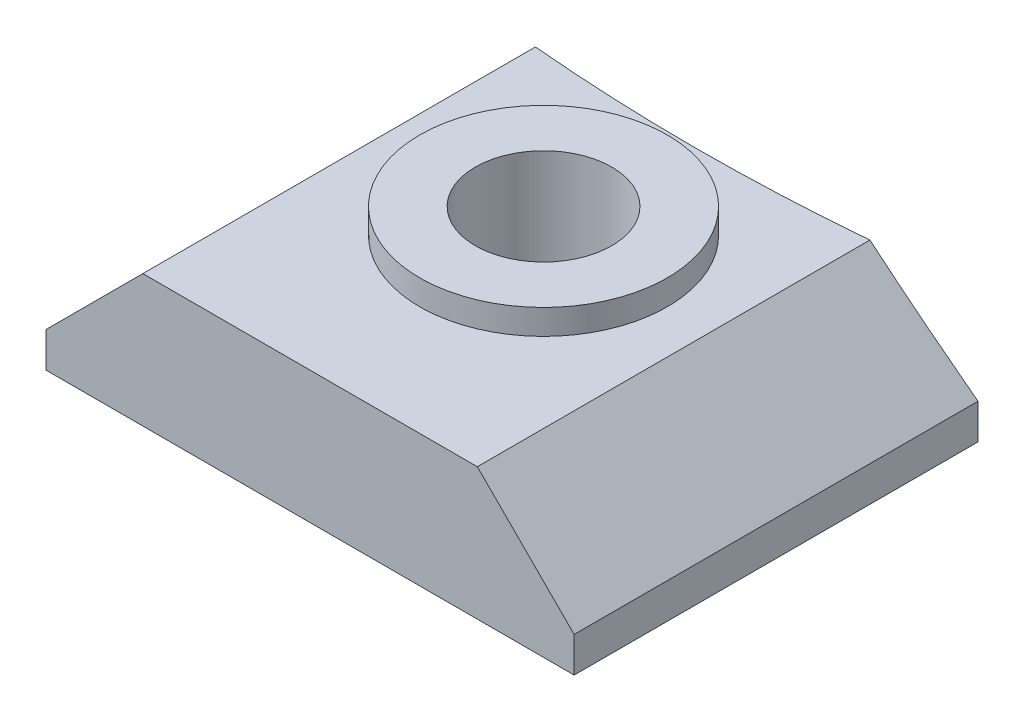
ISO-10303-21;
HEADER;
FILE_DESCRIPTION(('STEP AP214'),'2;1');
FILE_NAME('part.step','',(''),(''),'','','');
FILE_SCHEMA(('AUTOMOTIVE_DESIGN { 1 0 10303 214 1 1 1 1 }'));
ENDSEC;
DATA;
#1=APPLICATION_CONTEXT('core data for automotive mechanical design processes');
#2=APPLICATION_PROTOCOL_DEFINITION('international standard','automotive_design',2000,#1);
#3=PRODUCT_CONTEXT('',#1,'mechanical');
#4=PRODUCT('Part','Part','',(#3));
#5=PRODUCT_RELATED_PRODUCT_CATEGORY('part','',(#4));
#6=PRODUCT_DEFINITION_FORMATION('','',#4);
#7=PRODUCT_DEFINITION_CONTEXT('part definition',#1,'design');
#8=PRODUCT_DEFINITION('design','',#6,#7);
#9=PRODUCT_DEFINITION_SHAPE('','',#8);
#10=(LENGTH_UNIT() NAMED_UNIT(*) SI_UNIT(.MILLI.,.METRE.));
#11=(NAMED_UNIT(*) PLANE_ANGLE_UNIT() SI_UNIT($,.RADIAN.));
#12=(NAMED_UNIT(*) SI_UNIT($,.STERADIAN.) SOLID_ANGLE_UNIT());
#13=UNCERTAINTY_MEASURE_WITH_UNIT(LENGTH_MEASURE(1.E-05),#10,'distance_accuracy_value','');
#14=(GEOMETRIC_REPRESENTATION_CONTEXT(3) GLOBAL_UNCERTAINTY_ASSIGNED_CONTEXT((#13)) GLOBAL_UNIT_ASSIGNED_CONTEXT((#10,
#11,#12)) REPRESENTATION_CONTEXT('',''));
#15=CARTESIAN_POINT('',(0.,0.,0.));
#16=DIRECTION('',(0.,0.,1.));
#17=DIRECTION('',(1.,0.,0.));
#18=AXIS2_PLACEMENT_3D('',#15,#16,#17);
#19=CARTESIAN_POINT('',(-12.,1.6,22.));
#20=DIRECTION('',(1.,0.,0.));
#21=DIRECTION('',(0.,0.,-1.));
#22=AXIS2_PLACEMENT_3D('',#19,#20,#21);
#23=PLANE('',#22);
#24=DIRECTION('',(0.,0.,-1.));
#25=VECTOR('',#24,1.);
#26=CARTESIAN_POINT('',(-12.,1.6,22.));
#27=LINE('',#26,#25);
#28=CARTESIAN_POINT('',(-12.,1.6,22.));
#29=VERTEX_POINT('',#28);
#30=CARTESIAN_POINT('',(-12.,1.6,3.6486779456457));
#31=VERTEX_POINT('',#30);
#32=EDGE_CURVE('E119',#29,#31,#27,.T.);
#33=ORIENTED_EDGE('',*,*,#32,.T.);
#34=DIRECTION('',(0.,1.,0.));
#35=VECTOR('',#34,1.);
#36=CARTESIAN_POINT('',(-12.,0.,3.6486779456457));
#37=LINE('',#36,#35);
#38=CARTESIAN_POINT('',(-12.,0.,3.6486779456457));
#39=VERTEX_POINT('',#38);
#40=EDGE_CURVE('E50',#39,#31,#37,.T.);
#41=ORIENTED_EDGE('',*,*,#40,.F.);
#42=DIRECTION('',(0.,0.,-1.));
#43=VECTOR('',#42,1.);
#44=CARTESIAN_POINT('',(-12.,0.,22.));
#45=LINE('',#44,#43);
#46=CARTESIAN_POINT('',(-12.,0.,22.));
#47=VERTEX_POINT('',#46);
#48=EDGE_CURVE('E104',#47,#39,#45,.T.);
#49=ORIENTED_EDGE('',*,*,#48,.F.);
#50=DIRECTION('',(0.,-1.,0.));
#51=VECTOR('',#50,1.);
#52=CARTESIAN_POINT('',(-12.,1.6,22.));
#53=LINE('',#52,#51);
#54=EDGE_CURVE('E130',#29,#47,#53,.T.);
#55=ORIENTED_EDGE('',*,*,#54,.F.);
#56=EDGE_LOOP('',(#33,#41,#49,#55));
#57=FACE_BOUND('',#56,.T.);
#58=ADVANCED_FACE('F36',(#57),#23,.F.);
#59=CARTESIAN_POINT('',(-12.,0.,22.));
#60=DIRECTION('',(0.,1.,0.));
#61=DIRECTION('',(-1.,0.,0.));
#62=AXIS2_PLACEMENT_3D('',#59,#60,#61);
#63=PLANE('',#62);
#64=CARTESIAN_POINT('',(0.,0.,11.3910647809234));
#65=DIRECTION('',(0.,1.,0.));
#66=DIRECTION('',(-1.,0.,0.));
#67=AXIS2_PLACEMENT_3D('',#64,#65,#66);
#68=CIRCLE('',#67,3.1);
#69=CARTESIAN_POINT('',(-3.1,0.,11.3910647809234));
#70=VERTEX_POINT('',#69);
#71=EDGE_CURVE('E137',#70,#70,#68,.T.);
#72=ORIENTED_EDGE('',*,*,#71,.T.);
#73=EDGE_LOOP('',(#72));
#74=FACE_BOUND('',#73,.T.);
#75=ORIENTED_EDGE('',*,*,#48,.T.);
#76=CARTESIAN_POINT('',(0.,0.,-80.5));
#77=DIRECTION('',(0.,1.,0.));
#78=DIRECTION('',(0.,0.,1.));
#79=AXIS2_PLACEMENT_3D('',#76,#77,#78);
#80=CIRCLE('',#79,85.);
#81=CARTESIAN_POINT('',(12.,0.,3.6486779456457));
#82=VERTEX_POINT('',#81);
#83=EDGE_CURVE('E89',#39,#82,#80,.T.);
#84=ORIENTED_EDGE('',*,*,#83,.T.);
#85=DIRECTION('',(0.,0.,-1.));
#86=VECTOR('',#85,1.);
#87=CARTESIAN_POINT('',(12.,0.,22.));
#88=LINE('',#87,#86);
#89=CARTESIAN_POINT('',(12.,0.,22.));
#90=VERTEX_POINT('',#89);
#91=EDGE_CURVE('E101',#90,#82,#88,.T.);
#92=ORIENTED_EDGE('',*,*,#91,.F.);
#93=DIRECTION('',(1.,0.,0.));
#94=VECTOR('',#93,1.);
#95=CARTESIAN_POINT('',(-12.,0.,22.));
#96=LINE('',#95,#94);
#97=EDGE_CURVE('E128',#47,#90,#96,.T.);
#98=ORIENTED_EDGE('',*,*,#97,.F.);
#99=EDGE_LOOP('',(#75,#84,#92,#98));
#100=FACE_BOUND('',#99,.T.);
#101=ADVANCED_FACE('F100',(#74,#100),#63,.F.);
#102=CARTESIAN_POINT('',(12.,0.,22.));
#103=DIRECTION('',(-1.,0.,0.));
#104=DIRECTION('',(0.,0.,1.));
#105=AXIS2_PLACEMENT_3D('',#102,#103,#104);
#106=PLANE('',#105);
#107=ORIENTED_EDGE('',*,*,#91,.T.);
#108=DIRECTION('',(0.,1.,0.));
#109=VECTOR('',#108,1.);
#110=CARTESIAN_POINT('',(12.,0.,3.6486779456457));
#111=LINE('',#110,#109);
#112=CARTESIAN_POINT('',(12.,1.59999999999991,3.6486779456457));
#113=VERTEX_POINT('',#112);
#114=EDGE_CURVE('E86',#82,#113,#111,.T.);
#115=ORIENTED_EDGE('',*,*,#114,.T.);
#116=DIRECTION('',(0.,0.,-1.));
#117=VECTOR('',#116,1.);
#118=CARTESIAN_POINT('',(12.,1.59999999999991,22.));
#119=LINE('',#118,#117);
#120=CARTESIAN_POINT('',(12.,1.59999999999991,22.));
#121=VERTEX_POINT('',#120);
#122=EDGE_CURVE('E109',#121,#113,#119,.T.);
#123=ORIENTED_EDGE('',*,*,#122,.F.);
#124=DIRECTION('',(0.,1.,0.));
#125=VECTOR('',#124,1.);
#126=CARTESIAN_POINT('',(12.,0.,22.));
#127=LINE('',#126,#125);
#128=EDGE_CURVE('E108',#90,#121,#127,.T.);
#129=ORIENTED_EDGE('',*,*,#128,.F.);
#130=EDGE_LOOP('',(#107,#115,#123,#129));
#131=FACE_BOUND('',#130,.T.);
#132=ADVANCED_FACE('F107',(#131),#106,.F.);
#133=CARTESIAN_POINT('',(12.,1.59999999999991,22.));
#134=DIRECTION('',(-0.707106781186551,-0.707106781186544,0.));
#135=DIRECTION('',(0.707106781186544,-0.707106781186551,0.));
#136=AXIS2_PLACEMENT_3D('',#133,#134,#135);
#137=PLANE('',#136);
#138=ORIENTED_EDGE('',*,*,#122,.T.);
#139=CARTESIAN_POINT('',(0.,13.6,-80.5));
#140=DIRECTION('',(-0.707106781186551,-0.707106781186544,0.));
#141=DIRECTION('',(-0.707106781186544,0.707106781186551,0.));
#142=AXIS2_PLACEMENT_3D('',#139,#140,#141);
#143=ELLIPSE('',#142,120.208152801714,85.);
#144=CARTESIAN_POINT('',(7.59999999999996,6.,4.15955350697285));
#145=VERTEX_POINT('',#144);
#146=EDGE_CURVE('E91',#113,#145,#143,.T.);
#147=ORIENTED_EDGE('',*,*,#146,.T.);
#148=DIRECTION('',(0.,0.,-1.));
#149=VECTOR('',#148,1.);
#150=CARTESIAN_POINT('',(7.59999999999996,6.,22.));
#151=LINE('',#150,#149);
#152=CARTESIAN_POINT('',(7.59999999999996,6.,22.));
#153=VERTEX_POINT('',#152);
#154=EDGE_CURVE('E111',#153,#145,#151,.T.);
#155=ORIENTED_EDGE('',*,*,#154,.F.);
#156=DIRECTION('',(-0.707106781186544,0.707106781186551,0.));
#157=VECTOR('',#156,1.);
#158=CARTESIAN_POINT('',(12.,1.59999999999991,22.));
#159=LINE('',#158,#157);
#160=EDGE_CURVE('E125',#121,#153,#159,.T.);
#161=ORIENTED_EDGE('',*,*,#160,.F.);
#162=EDGE_LOOP('',(#138,#147,#155,#161));
#163=FACE_BOUND('',#162,.T.);
#164=ADVANCED_FACE('F150',(#163),#137,.F.);
#165=CARTESIAN_POINT('',(7.59999999999996,6.,22.));
#166=DIRECTION('',(0.,-1.,0.));
#167=DIRECTION('',(0.,0.,-1.));
#168=AXIS2_PLACEMENT_3D('',#165,#166,#167);
#169=PLANE('',#168);
#170=CARTESIAN_POINT('',(0.,6.,11.3910647809234));
#171=DIRECTION('',(0.,1.,0.));
#172=DIRECTION('',(-1.,0.,0.));
#173=AXIS2_PLACEMENT_3D('',#170,#171,#172);
#174=CIRCLE('',#173,5.625);
#175=CARTESIAN_POINT('',(-5.625,6.,11.3910647809234));
#176=VERTEX_POINT('',#175);
#177=EDGE_CURVE('E43',#176,#176,#174,.T.);
#178=ORIENTED_EDGE('',*,*,#177,.F.);
#179=EDGE_LOOP('',(#178));
#180=FACE_BOUND('',#179,.T.);
#181=ORIENTED_EDGE('',*,*,#154,.T.);
#182=CARTESIAN_POINT('',(0.,6.,-80.5));
#183=DIRECTION('',(0.,1.,0.));
#184=DIRECTION('',(0.,0.,1.));
#185=AXIS2_PLACEMENT_3D('',#182,#183,#184);
#186=CIRCLE('',#185,85.);
#187=CARTESIAN_POINT('',(-7.59999999999996,6.,4.15955350697285));
#188=VERTEX_POINT('',#187);
#189=EDGE_CURVE('E105',#188,#145,#186,.T.);
#190=ORIENTED_EDGE('',*,*,#189,.F.);
#191=DIRECTION('',(0.,0.,-1.));
#192=VECTOR('',#191,1.);
#193=CARTESIAN_POINT('',(-7.59999999999996,6.,22.));
#194=LINE('',#193,#192);
#195=CARTESIAN_POINT('',(-7.59999999999996,6.,22.));
#196=VERTEX_POINT('',#195);
#197=EDGE_CURVE('E116',#196,#188,#194,.T.);
#198=ORIENTED_EDGE('',*,*,#197,.F.);
#199=DIRECTION('',(-1.,0.,0.));
#200=VECTOR('',#199,1.);
#201=CARTESIAN_POINT('',(7.59999999999996,6.,22.));
#202=LINE('',#201,#200);
#203=EDGE_CURVE('E123',#153,#196,#202,.T.);
#204=ORIENTED_EDGE('',*,*,#203,.F.);
#205=EDGE_LOOP('',(#181,#190,#198,#204));
#206=FACE_BOUND('',#205,.T.);
#207=ADVANCED_FACE('F153',(#180,#206),#169,.F.);
#208=CARTESIAN_POINT('',(-7.59999999999996,6.,22.));
#209=DIRECTION('',(0.707106781186544,-0.707106781186551,0.));
#210=DIRECTION('',(0.707106781186551,0.707106781186544,0.));
#211=AXIS2_PLACEMENT_3D('',#208,#209,#210);
#212=PLANE('',#211);
#213=ORIENTED_EDGE('',*,*,#197,.T.);
#214=CARTESIAN_POINT('',(0.,13.5999999999999,-80.5));
#215=DIRECTION('',(0.707106781186544,-0.707106781186551,0.));
#216=DIRECTION('',(0.707106781186551,0.707106781186544,0.));
#217=AXIS2_PLACEMENT_3D('',#214,#215,#216);
#218=ELLIPSE('',#217,120.208152801712,85.);
#219=EDGE_CURVE('E11',#188,#31,#218,.T.);
#220=ORIENTED_EDGE('',*,*,#219,.T.);
#221=ORIENTED_EDGE('',*,*,#32,.F.);
#222=DIRECTION('',(-0.707106781186551,-0.707106781186544,0.));
#223=VECTOR('',#222,1.);
#224=CARTESIAN_POINT('',(-7.59999999999996,6.,22.));
#225=LINE('',#224,#223);
#226=EDGE_CURVE('E57',#196,#29,#225,.T.);
#227=ORIENTED_EDGE('',*,*,#226,.F.);
#228=EDGE_LOOP('',(#213,#220,#221,#227));
#229=FACE_BOUND('',#228,.T.);
#230=ADVANCED_FACE('F158',(#229),#212,.F.);
#231=CARTESIAN_POINT('',(0.,0.,22.));
#232=DIRECTION('',(0.,0.,1.));
#233=DIRECTION('',(1.,0.,0.));
#234=AXIS2_PLACEMENT_3D('',#231,#232,#233);
#235=PLANE('',#234);
#236=ORIENTED_EDGE('',*,*,#54,.T.);
#237=ORIENTED_EDGE('',*,*,#97,.T.);
#238=ORIENTED_EDGE('',*,*,#128,.T.);
#239=ORIENTED_EDGE('',*,*,#160,.T.);
#240=ORIENTED_EDGE('',*,*,#203,.T.);
#241=ORIENTED_EDGE('',*,*,#226,.T.);
#242=EDGE_LOOP('',(#236,#237,#238,#239,#240,#241));
#243=FACE_BOUND('',#242,.T.);
#244=ADVANCED_FACE('F154',(#243),#235,.T.);
#245=CARTESIAN_POINT('',(0.,7.14,11.3910647809234));
#246=DIRECTION('',(0.,-1.,0.));
#247=DIRECTION('',(1.,0.,0.));
#248=AXIS2_PLACEMENT_3D('',#245,#246,#247);
#249=CYLINDRICAL_SURFACE('',#248,5.625);
#250=CARTESIAN_POINT('',(0.,7.14,11.3910647809234));
#251=DIRECTION('',(0.,1.,0.));
#252=DIRECTION('',(-1.,0.,0.));
#253=AXIS2_PLACEMENT_3D('',#250,#251,#252);
#254=CIRCLE('',#253,5.625);
#255=CARTESIAN_POINT('',(-5.625,7.14,11.3910647809234));
#256=VERTEX_POINT('',#255);
#257=EDGE_CURVE('E132',#256,#256,#254,.T.);
#258=ORIENTED_EDGE('',*,*,#257,.F.);
#259=EDGE_LOOP('',(#258));
#260=FACE_BOUND('',#259,.T.);
#261=ORIENTED_EDGE('',*,*,#177,.T.);
#262=EDGE_LOOP('',(#261));
#263=FACE_BOUND('',#262,.T.);
#264=ADVANCED_FACE('F165',(#260,#263),#249,.T.);
#265=CARTESIAN_POINT('',(0.,7.14,11.3910647809234));
#266=DIRECTION('',(0.,1.,0.));
#267=DIRECTION('',(-1.,0.,0.));
#268=AXIS2_PLACEMENT_3D('',#265,#266,#267);
#269=PLANE('',#268);
#270=CARTESIAN_POINT('',(0.,7.14,11.3910647809234));
#271=DIRECTION('',(0.,1.,0.));
#272=DIRECTION('',(-1.,0.,0.));
#273=AXIS2_PLACEMENT_3D('',#270,#271,#272);
#274=CIRCLE('',#273,3.1);
#275=CARTESIAN_POINT('',(-3.1,7.14,11.3910647809234));
#276=VERTEX_POINT('',#275);
#277=EDGE_CURVE('E138',#276,#276,#274,.T.);
#278=ORIENTED_EDGE('',*,*,#277,.F.);
#279=EDGE_LOOP('',(#278));
#280=FACE_BOUND('',#279,.T.);
#281=ORIENTED_EDGE('',*,*,#257,.T.);
#282=EDGE_LOOP('',(#281));
#283=FACE_BOUND('',#282,.T.);
#284=ADVANCED_FACE('F211',(#280,#283),#269,.T.);
#285=CARTESIAN_POINT('',(0.,0.,11.3910647809234));
#286=DIRECTION('',(0.,1.,0.));
#287=DIRECTION('',(-1.,0.,0.));
#288=AXIS2_PLACEMENT_3D('',#285,#286,#287);
#289=CYLINDRICAL_SURFACE('',#288,3.1);
#290=ORIENTED_EDGE('',*,*,#71,.F.);
#291=EDGE_LOOP('',(#290));
#292=FACE_BOUND('',#291,.T.);
#293=ORIENTED_EDGE('',*,*,#277,.T.);
#294=EDGE_LOOP('',(#293));
#295=FACE_BOUND('',#294,.T.);
#296=ADVANCED_FACE('F201',(#292,#295),#289,.F.);
#297=CARTESIAN_POINT('',(0.,0.,-80.5));
#298=DIRECTION('',(0.,1.,0.));
#299=DIRECTION('',(0.,0.,1.));
#300=AXIS2_PLACEMENT_3D('',#297,#298,#299);
#301=CYLINDRICAL_SURFACE('',#300,85.);
#302=ORIENTED_EDGE('',*,*,#114,.F.);
#303=ORIENTED_EDGE('',*,*,#83,.F.);
#304=ORIENTED_EDGE('',*,*,#40,.T.);
#305=ORIENTED_EDGE('',*,*,#219,.F.);
#306=ORIENTED_EDGE('',*,*,#189,.T.);
#307=ORIENTED_EDGE('',*,*,#146,.F.);
#308=EDGE_LOOP('',(#302,#303,#304,#305,#306,#307));
#309=FACE_BOUND('',#308,.T.);
#310=ADVANCED_FACE('F88',(#309),#301,.F.);
#311=CLOSED_SHELL('',(#58,#101,#132,#164,#207,#230,#244,#264,#284,#296,#310));
#312=MANIFOLD_SOLID_BREP('B2',#311);
#313=ADVANCED_BREP_SHAPE_REPRESENTATION('',(#18,#312),#14);
#314=SHAPE_DEFINITION_REPRESENTATION(#9,#313);
ENDSEC;
END-ISO-10303-21;
